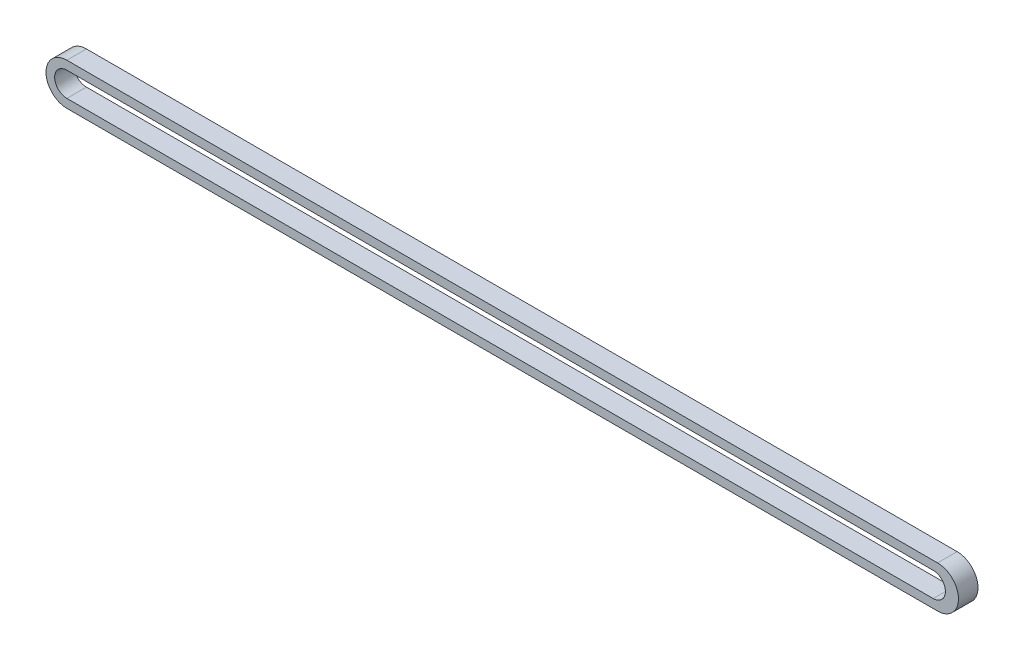
ISO-10303-21;
HEADER;
FILE_DESCRIPTION(('STEP AP214'),'2;1');
FILE_NAME('part.step','',(''),(''),'','','');
FILE_SCHEMA(('AUTOMOTIVE_DESIGN { 1 0 10303 214 1 1 1 1 }'));
ENDSEC;
DATA;
#1=APPLICATION_CONTEXT('core data for automotive mechanical design processes');
#2=APPLICATION_PROTOCOL_DEFINITION('international standard','automotive_design',2000,#1);
#3=PRODUCT_CONTEXT('',#1,'mechanical');
#4=PRODUCT('Part','Part','',(#3));
#5=PRODUCT_RELATED_PRODUCT_CATEGORY('part','',(#4));
#6=PRODUCT_DEFINITION_FORMATION('','',#4);
#7=PRODUCT_DEFINITION_CONTEXT('part definition',#1,'design');
#8=PRODUCT_DEFINITION('design','',#6,#7);
#9=PRODUCT_DEFINITION_SHAPE('','',#8);
#10=(LENGTH_UNIT() NAMED_UNIT(*) SI_UNIT(.MILLI.,.METRE.));
#11=(NAMED_UNIT(*) PLANE_ANGLE_UNIT() SI_UNIT($,.RADIAN.));
#12=(NAMED_UNIT(*) SI_UNIT($,.STERADIAN.) SOLID_ANGLE_UNIT());
#13=UNCERTAINTY_MEASURE_WITH_UNIT(LENGTH_MEASURE(1.E-05),#10,'distance_accuracy_value','');
#14=(GEOMETRIC_REPRESENTATION_CONTEXT(3) GLOBAL_UNCERTAINTY_ASSIGNED_CONTEXT((#13)) GLOBAL_UNIT_ASSIGNED_CONTEXT((#10,
#11,#12)) REPRESENTATION_CONTEXT('',''));
#15=CARTESIAN_POINT('',(0.,0.,0.));
#16=DIRECTION('',(0.,0.,1.));
#17=DIRECTION('',(1.,0.,0.));
#18=AXIS2_PLACEMENT_3D('',#15,#16,#17);
#19=CARTESIAN_POINT('',(0.,0.,-3.));
#20=DIRECTION('',(0.,0.,1.));
#21=DIRECTION('',(1.,0.,0.));
#22=AXIS2_PLACEMENT_3D('',#19,#20,#21);
#23=CYLINDRICAL_SURFACE('',#22,3.2);
#24=CARTESIAN_POINT('',(0.,0.,0.));
#25=DIRECTION('',(0.,0.,1.));
#26=DIRECTION('',(1.,0.,0.));
#27=AXIS2_PLACEMENT_3D('',#24,#25,#26);
#28=CIRCLE('',#27,3.2);
#29=CARTESIAN_POINT('',(0.,3.2,0.));
#30=VERTEX_POINT('',#29);
#31=CARTESIAN_POINT('',(0.,-3.2,0.));
#32=VERTEX_POINT('',#31);
#33=EDGE_CURVE('E139',#30,#32,#28,.T.);
#34=ORIENTED_EDGE('',*,*,#33,.F.);
#35=DIRECTION('',(0.,0.,1.));
#36=VECTOR('',#35,1.);
#37=CARTESIAN_POINT('',(0.,3.2,-3.));
#38=LINE('',#37,#36);
#39=CARTESIAN_POINT('',(0.,3.2,-3.));
#40=VERTEX_POINT('',#39);
#41=EDGE_CURVE('E11',#40,#30,#38,.T.);
#42=ORIENTED_EDGE('',*,*,#41,.F.);
#43=CARTESIAN_POINT('',(0.,0.,-3.));
#44=DIRECTION('',(0.,0.,1.));
#45=DIRECTION('',(1.,0.,0.));
#46=AXIS2_PLACEMENT_3D('',#43,#44,#45);
#47=CIRCLE('',#46,3.2);
#48=CARTESIAN_POINT('',(0.,-3.2,-3.));
#49=VERTEX_POINT('',#48);
#50=EDGE_CURVE('E143',#40,#49,#47,.T.);
#51=ORIENTED_EDGE('',*,*,#50,.T.);
#52=DIRECTION('',(0.,0.,1.));
#53=VECTOR('',#52,1.);
#54=CARTESIAN_POINT('',(0.,-3.2,-3.));
#55=LINE('',#54,#53);
#56=EDGE_CURVE('E44',#49,#32,#55,.T.);
#57=ORIENTED_EDGE('',*,*,#56,.T.);
#58=EDGE_LOOP('',(#34,#42,#51,#57));
#59=FACE_BOUND('',#58,.T.);
#60=ADVANCED_FACE('F41',(#59),#23,.T.);
#61=CARTESIAN_POINT('',(0.,3.2,-3.));
#62=DIRECTION('',(0.,1.,0.));
#63=DIRECTION('',(-1.,0.,0.));
#64=AXIS2_PLACEMENT_3D('',#61,#62,#63);
#65=PLANE('',#64);
#66=DIRECTION('',(-1.,0.,0.));
#67=VECTOR('',#66,1.);
#68=CARTESIAN_POINT('',(0.,3.2,0.));
#69=LINE('',#68,#67);
#70=CARTESIAN_POINT('',(133.6,3.2,0.));
#71=VERTEX_POINT('',#70);
#72=EDGE_CURVE('E147',#71,#30,#69,.T.);
#73=ORIENTED_EDGE('',*,*,#72,.F.);
#74=DIRECTION('',(0.,0.,1.));
#75=VECTOR('',#74,1.);
#76=CARTESIAN_POINT('',(133.6,3.2,-3.));
#77=LINE('',#76,#75);
#78=CARTESIAN_POINT('',(133.6,3.2,-3.));
#79=VERTEX_POINT('',#78);
#80=EDGE_CURVE('E49',#79,#71,#77,.T.);
#81=ORIENTED_EDGE('',*,*,#80,.F.);
#82=DIRECTION('',(-1.,0.,0.));
#83=VECTOR('',#82,1.);
#84=CARTESIAN_POINT('',(0.,3.2,-3.));
#85=LINE('',#84,#83);
#86=EDGE_CURVE('E153',#79,#40,#85,.T.);
#87=ORIENTED_EDGE('',*,*,#86,.T.);
#88=ORIENTED_EDGE('',*,*,#41,.T.);
#89=EDGE_LOOP('',(#73,#81,#87,#88));
#90=FACE_BOUND('',#89,.T.);
#91=ADVANCED_FACE('F179',(#90),#65,.T.);
#92=CARTESIAN_POINT('',(133.6,0.,-3.));
#93=DIRECTION('',(0.,0.,1.));
#94=DIRECTION('',(1.,0.,0.));
#95=AXIS2_PLACEMENT_3D('',#92,#93,#94);
#96=CYLINDRICAL_SURFACE('',#95,3.2);
#97=CARTESIAN_POINT('',(133.6,0.,0.));
#98=DIRECTION('',(0.,0.,1.));
#99=DIRECTION('',(1.,0.,0.));
#100=AXIS2_PLACEMENT_3D('',#97,#98,#99);
#101=CIRCLE('',#100,3.2);
#102=CARTESIAN_POINT('',(133.6,-3.2,0.));
#103=VERTEX_POINT('',#102);
#104=EDGE_CURVE('E161',#103,#71,#101,.T.);
#105=ORIENTED_EDGE('',*,*,#104,.F.);
#106=DIRECTION('',(0.,0.,1.));
#107=VECTOR('',#106,1.);
#108=CARTESIAN_POINT('',(133.6,-3.2,-3.));
#109=LINE('',#108,#107);
#110=CARTESIAN_POINT('',(133.6,-3.2,-3.));
#111=VERTEX_POINT('',#110);
#112=EDGE_CURVE('E166',#111,#103,#109,.T.);
#113=ORIENTED_EDGE('',*,*,#112,.F.);
#114=CARTESIAN_POINT('',(133.6,0.,-3.));
#115=DIRECTION('',(0.,0.,1.));
#116=DIRECTION('',(1.,0.,0.));
#117=AXIS2_PLACEMENT_3D('',#114,#115,#116);
#118=CIRCLE('',#117,3.2);
#119=EDGE_CURVE('E150',#111,#79,#118,.T.);
#120=ORIENTED_EDGE('',*,*,#119,.T.);
#121=ORIENTED_EDGE('',*,*,#80,.T.);
#122=EDGE_LOOP('',(#105,#113,#120,#121));
#123=FACE_BOUND('',#122,.T.);
#124=ADVANCED_FACE('F183',(#123),#96,.T.);
#125=CARTESIAN_POINT('',(0.,-3.2,-3.));
#126=DIRECTION('',(0.,-1.,0.));
#127=DIRECTION('',(1.,0.,0.));
#128=AXIS2_PLACEMENT_3D('',#125,#126,#127);
#129=PLANE('',#128);
#130=DIRECTION('',(1.,0.,0.));
#131=VECTOR('',#130,1.);
#132=CARTESIAN_POINT('',(0.,-3.2,0.));
#133=LINE('',#132,#131);
#134=EDGE_CURVE('E158',#32,#103,#133,.T.);
#135=ORIENTED_EDGE('',*,*,#134,.F.);
#136=ORIENTED_EDGE('',*,*,#56,.F.);
#137=DIRECTION('',(1.,0.,0.));
#138=VECTOR('',#137,1.);
#139=CARTESIAN_POINT('',(0.,-3.2,-3.));
#140=LINE('',#139,#138);
#141=EDGE_CURVE('E146',#49,#111,#140,.T.);
#142=ORIENTED_EDGE('',*,*,#141,.T.);
#143=ORIENTED_EDGE('',*,*,#112,.T.);
#144=EDGE_LOOP('',(#135,#136,#142,#143));
#145=FACE_BOUND('',#144,.T.);
#146=ADVANCED_FACE('F174',(#145),#129,.T.);
#147=CARTESIAN_POINT('',(0.,0.,-3.));
#148=DIRECTION('',(0.,0.,1.));
#149=DIRECTION('',(1.,0.,0.));
#150=AXIS2_PLACEMENT_3D('',#147,#148,#149);
#151=PLANE('',#150);
#152=DIRECTION('',(-1.,0.,0.));
#153=VECTOR('',#152,1.);
#154=CARTESIAN_POINT('',(0.,1.872,-3.));
#155=LINE('',#154,#153);
#156=CARTESIAN_POINT('',(132.928,1.872,-3.));
#157=VERTEX_POINT('',#156);
#158=CARTESIAN_POINT('',(0.,1.872,-3.));
#159=VERTEX_POINT('',#158);
#160=EDGE_CURVE('E114',#157,#159,#155,.T.);
#161=ORIENTED_EDGE('',*,*,#160,.T.);
#162=CARTESIAN_POINT('',(0.,0.,-3.));
#163=DIRECTION('',(0.,0.,1.));
#164=DIRECTION('',(1.,0.,0.));
#165=AXIS2_PLACEMENT_3D('',#162,#163,#164);
#166=CIRCLE('',#165,1.872);
#167=CARTESIAN_POINT('',(0.,-1.872,-3.));
#168=VERTEX_POINT('',#167);
#169=EDGE_CURVE('E108',#159,#168,#166,.T.);
#170=ORIENTED_EDGE('',*,*,#169,.T.);
#171=DIRECTION('',(1.,0.,0.));
#172=VECTOR('',#171,1.);
#173=CARTESIAN_POINT('',(0.,-1.872,-3.));
#174=LINE('',#173,#172);
#175=CARTESIAN_POINT('',(132.928,-1.872,-3.));
#176=VERTEX_POINT('',#175);
#177=EDGE_CURVE('E117',#168,#176,#174,.T.);
#178=ORIENTED_EDGE('',*,*,#177,.T.);
#179=CARTESIAN_POINT('',(132.928,0.,-3.));
#180=DIRECTION('',(0.,0.,1.));
#181=DIRECTION('',(1.,0.,0.));
#182=AXIS2_PLACEMENT_3D('',#179,#180,#181);
#183=CIRCLE('',#182,1.872);
#184=EDGE_CURVE('E57',#176,#157,#183,.T.);
#185=ORIENTED_EDGE('',*,*,#184,.T.);
#186=EDGE_LOOP('',(#161,#170,#178,#185));
#187=FACE_BOUND('',#186,.T.);
#188=ORIENTED_EDGE('',*,*,#50,.F.);
#189=ORIENTED_EDGE('',*,*,#86,.F.);
#190=ORIENTED_EDGE('',*,*,#119,.F.);
#191=ORIENTED_EDGE('',*,*,#141,.F.);
#192=EDGE_LOOP('',(#188,#189,#190,#191));
#193=FACE_BOUND('',#192,.T.);
#194=ADVANCED_FACE('F121',(#187,#193),#151,.F.);
#195=CARTESIAN_POINT('',(0.,0.,0.));
#196=DIRECTION('',(0.,0.,1.));
#197=DIRECTION('',(1.,0.,0.));
#198=AXIS2_PLACEMENT_3D('',#195,#196,#197);
#199=PLANE('',#198);
#200=CARTESIAN_POINT('',(0.,0.,0.));
#201=DIRECTION('',(0.,0.,1.));
#202=DIRECTION('',(1.,0.,0.));
#203=AXIS2_PLACEMENT_3D('',#200,#201,#202);
#204=CIRCLE('',#203,1.872);
#205=CARTESIAN_POINT('',(0.,1.872,0.));
#206=VERTEX_POINT('',#205);
#207=CARTESIAN_POINT('',(0.,-1.872,0.));
#208=VERTEX_POINT('',#207);
#209=EDGE_CURVE('E65',#206,#208,#204,.T.);
#210=ORIENTED_EDGE('',*,*,#209,.F.);
#211=DIRECTION('',(-1.,0.,0.));
#212=VECTOR('',#211,1.);
#213=CARTESIAN_POINT('',(0.,1.872,0.));
#214=LINE('',#213,#212);
#215=CARTESIAN_POINT('',(132.928,1.872,0.));
#216=VERTEX_POINT('',#215);
#217=EDGE_CURVE('E124',#216,#206,#214,.T.);
#218=ORIENTED_EDGE('',*,*,#217,.F.);
#219=CARTESIAN_POINT('',(132.928,0.,0.));
#220=DIRECTION('',(0.,0.,1.));
#221=DIRECTION('',(1.,0.,0.));
#222=AXIS2_PLACEMENT_3D('',#219,#220,#221);
#223=CIRCLE('',#222,1.872);
#224=CARTESIAN_POINT('',(132.928,-1.872,0.));
#225=VERTEX_POINT('',#224);
#226=EDGE_CURVE('E127',#225,#216,#223,.T.);
#227=ORIENTED_EDGE('',*,*,#226,.F.);
#228=DIRECTION('',(1.,0.,0.));
#229=VECTOR('',#228,1.);
#230=CARTESIAN_POINT('',(0.,-1.872,0.));
#231=LINE('',#230,#229);
#232=EDGE_CURVE('E133',#208,#225,#231,.T.);
#233=ORIENTED_EDGE('',*,*,#232,.F.);
#234=EDGE_LOOP('',(#210,#218,#227,#233));
#235=FACE_BOUND('',#234,.T.);
#236=ORIENTED_EDGE('',*,*,#33,.T.);
#237=ORIENTED_EDGE('',*,*,#134,.T.);
#238=ORIENTED_EDGE('',*,*,#104,.T.);
#239=ORIENTED_EDGE('',*,*,#72,.T.);
#240=EDGE_LOOP('',(#236,#237,#238,#239));
#241=FACE_BOUND('',#240,.T.);
#242=ADVANCED_FACE('F176',(#235,#241),#199,.T.);
#243=CARTESIAN_POINT('',(0.,0.,-3.));
#244=DIRECTION('',(0.,0.,1.));
#245=DIRECTION('',(1.,0.,0.));
#246=AXIS2_PLACEMENT_3D('',#243,#244,#245);
#247=CYLINDRICAL_SURFACE('',#246,1.872);
#248=ORIENTED_EDGE('',*,*,#209,.T.);
#249=DIRECTION('',(0.,0.,1.));
#250=VECTOR('',#249,1.);
#251=CARTESIAN_POINT('',(0.,-1.872,-3.));
#252=LINE('',#251,#250);
#253=EDGE_CURVE('E104',#168,#208,#252,.T.);
#254=ORIENTED_EDGE('',*,*,#253,.F.);
#255=ORIENTED_EDGE('',*,*,#169,.F.);
#256=DIRECTION('',(0.,0.,1.));
#257=VECTOR('',#256,1.);
#258=CARTESIAN_POINT('',(0.,1.872,-3.));
#259=LINE('',#258,#257);
#260=EDGE_CURVE('E137',#159,#206,#259,.T.);
#261=ORIENTED_EDGE('',*,*,#260,.T.);
#262=EDGE_LOOP('',(#248,#254,#255,#261));
#263=FACE_BOUND('',#262,.T.);
#264=ADVANCED_FACE('F106',(#263),#247,.F.);
#265=CARTESIAN_POINT('',(0.,1.872,-3.));
#266=DIRECTION('',(0.,1.,0.));
#267=DIRECTION('',(0.,0.,1.));
#268=AXIS2_PLACEMENT_3D('',#265,#266,#267);
#269=PLANE('',#268);
#270=ORIENTED_EDGE('',*,*,#217,.T.);
#271=ORIENTED_EDGE('',*,*,#260,.F.);
#272=ORIENTED_EDGE('',*,*,#160,.F.);
#273=DIRECTION('',(0.,0.,1.));
#274=VECTOR('',#273,1.);
#275=CARTESIAN_POINT('',(132.928,1.872,-3.));
#276=LINE('',#275,#274);
#277=EDGE_CURVE('E140',#157,#216,#276,.T.);
#278=ORIENTED_EDGE('',*,*,#277,.T.);
#279=EDGE_LOOP('',(#270,#271,#272,#278));
#280=FACE_BOUND('',#279,.T.);
#281=ADVANCED_FACE('F236',(#280),#269,.F.);
#282=CARTESIAN_POINT('',(132.928,0.,-3.));
#283=DIRECTION('',(0.,0.,1.));
#284=DIRECTION('',(1.,0.,0.));
#285=AXIS2_PLACEMENT_3D('',#282,#283,#284);
#286=CYLINDRICAL_SURFACE('',#285,1.872);
#287=ORIENTED_EDGE('',*,*,#226,.T.);
#288=ORIENTED_EDGE('',*,*,#277,.F.);
#289=ORIENTED_EDGE('',*,*,#184,.F.);
#290=DIRECTION('',(0.,0.,1.));
#291=VECTOR('',#290,1.);
#292=CARTESIAN_POINT('',(132.928,-1.872,-3.));
#293=LINE('',#292,#291);
#294=EDGE_CURVE('E113',#176,#225,#293,.T.);
#295=ORIENTED_EDGE('',*,*,#294,.T.);
#296=EDGE_LOOP('',(#287,#288,#289,#295));
#297=FACE_BOUND('',#296,.T.);
#298=ADVANCED_FACE('F245',(#297),#286,.F.);
#299=CARTESIAN_POINT('',(0.,-1.872,-3.));
#300=DIRECTION('',(0.,-1.,0.));
#301=DIRECTION('',(0.,0.,-1.));
#302=AXIS2_PLACEMENT_3D('',#299,#300,#301);
#303=PLANE('',#302);
#304=ORIENTED_EDGE('',*,*,#232,.T.);
#305=ORIENTED_EDGE('',*,*,#294,.F.);
#306=ORIENTED_EDGE('',*,*,#177,.F.);
#307=ORIENTED_EDGE('',*,*,#253,.T.);
#308=EDGE_LOOP('',(#304,#305,#306,#307));
#309=FACE_BOUND('',#308,.T.);
#310=ADVANCED_FACE('F118',(#309),#303,.F.);
#311=CLOSED_SHELL('',(#60,#91,#124,#146,#194,#242,#264,#281,#298,#310));
#312=MANIFOLD_SOLID_BREP('B2',#311);
#313=ADVANCED_BREP_SHAPE_REPRESENTATION('',(#18,#312),#14);
#314=SHAPE_DEFINITION_REPRESENTATION(#9,#313);
ENDSEC;
END-ISO-10303-21;
